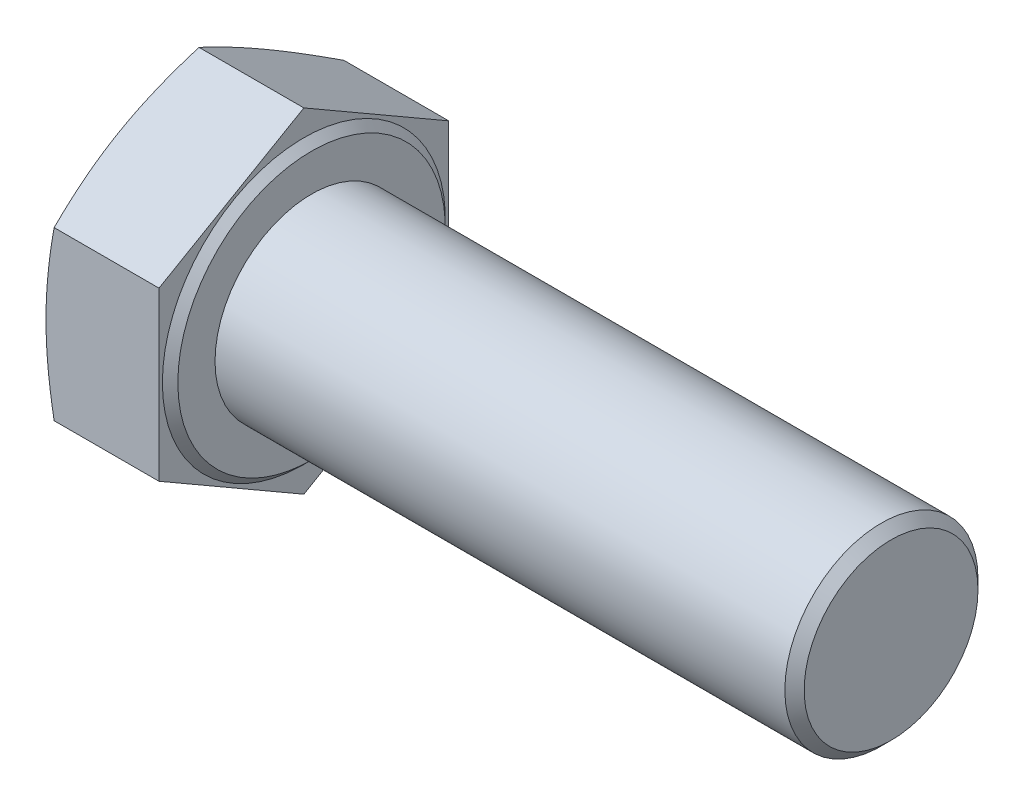
ISO-10303-21;
HEADER;
FILE_DESCRIPTION(('STEP AP214'),'2;1');
FILE_NAME('part.step','',(''),(''),'','','');
FILE_SCHEMA(('AUTOMOTIVE_DESIGN { 1 0 10303 214 1 1 1 1 }'));
ENDSEC;
DATA;
#1=APPLICATION_CONTEXT('core data for automotive mechanical design processes');
#2=APPLICATION_PROTOCOL_DEFINITION('international standard','automotive_design',2000,#1);
#3=PRODUCT_CONTEXT('',#1,'mechanical');
#4=PRODUCT('Part','Part','',(#3));
#5=PRODUCT_RELATED_PRODUCT_CATEGORY('part','',(#4));
#6=PRODUCT_DEFINITION_FORMATION('','',#4);
#7=PRODUCT_DEFINITION_CONTEXT('part definition',#1,'design');
#8=PRODUCT_DEFINITION('design','',#6,#7);
#9=PRODUCT_DEFINITION_SHAPE('','',#8);
#10=(LENGTH_UNIT() NAMED_UNIT(*) SI_UNIT(.MILLI.,.METRE.));
#11=(NAMED_UNIT(*) PLANE_ANGLE_UNIT() SI_UNIT($,.RADIAN.));
#12=(NAMED_UNIT(*) SI_UNIT($,.STERADIAN.) SOLID_ANGLE_UNIT());
#13=UNCERTAINTY_MEASURE_WITH_UNIT(LENGTH_MEASURE(1.E-05),#10,'distance_accuracy_value','');
#14=(GEOMETRIC_REPRESENTATION_CONTEXT(3) GLOBAL_UNCERTAINTY_ASSIGNED_CONTEXT((#13)) GLOBAL_UNIT_ASSIGNED_CONTEXT((#10,
#11,#12)) REPRESENTATION_CONTEXT('',''));
#15=CARTESIAN_POINT('',(0.,0.,0.));
#16=DIRECTION('',(0.,0.,1.));
#17=DIRECTION('',(1.,0.,0.));
#18=AXIS2_PLACEMENT_3D('',#15,#16,#17);
#19=CARTESIAN_POINT('',(-12.2341191525824,-14.3598036724861,16.3343559319878));
#20=DIRECTION('',(-1.,0.,0.));
#21=DIRECTION('',(0.,0.,1.));
#22=AXIS2_PLACEMENT_3D('',#19,#20,#21);
#23=PLANE('',#22);
#24=CARTESIAN_POINT('',(-12.2341191525824,-5.6995496346417,1.33435593198783));
#25=DIRECTION('',(-1.,0.,0.));
#26=DIRECTION('',(0.,0.,1.));
#27=AXIS2_PLACEMENT_3D('',#24,#25,#26);
#28=CIRCLE('',#27,13.85);
#29=CARTESIAN_POINT('',(-12.2341191525824,-5.6995496346417,15.1843559319878));
#30=VERTEX_POINT('',#29);
#31=EDGE_CURVE('E247',#30,#30,#28,.T.);
#32=ORIENTED_EDGE('',*,*,#31,.F.);
#33=EDGE_LOOP('',(#32));
#34=FACE_BOUND('',#33,.T.);
#35=CARTESIAN_POINT('',(-12.2341191525824,-5.6995496346417,1.33435593198783));
#36=DIRECTION('',(-1.,0.,0.));
#37=DIRECTION('',(0.,0.,1.));
#38=AXIS2_PLACEMENT_3D('',#35,#36,#37);
#39=CIRCLE('',#38,10.);
#40=CARTESIAN_POINT('',(-12.2341191525824,-5.6995496346417,11.3343559319878));
#41=VERTEX_POINT('',#40);
#42=EDGE_CURVE('E133',#41,#41,#39,.F.);
#43=ORIENTED_EDGE('',*,*,#42,.F.);
#44=EDGE_LOOP('',(#43));
#45=FACE_BOUND('',#44,.T.);
#46=ADVANCED_FACE('F16',(#34,#45),#23,.F.);
#47=CARTESIAN_POINT('',(-12.2341191525824,-14.3598036724861,16.3343559319878));
#48=DIRECTION('',(0.,0.866025403784439,-0.5));
#49=DIRECTION('',(0.,0.5,0.866025403784439));
#50=AXIS2_PLACEMENT_3D('',#47,#48,#49);
#51=PLANE('',#50);
#52=CARTESIAN_POINT('',(-23.8894812565745,-23.0201731803843,1.33415593198783));
#53=CARTESIAN_POINT('',(-23.9547548838417,-22.8408232676603,1.64479909315885));
#54=CARTESIAN_POINT('',(-24.0170929927835,-22.6612097713907,1.95589879442282));
#55=CARTESIAN_POINT('',(-24.1352523937545,-22.3014311375938,2.57905366763692));
#56=CARTESIAN_POINT('',(-24.1910730656882,-22.1212659492469,2.89110892760888));
#57=CARTESIAN_POINT('',(-24.3478444058877,-21.5797079193069,3.8291149507118));
#58=CARTESIAN_POINT('',(-24.4380123454216,-21.2175005518686,4.45647651399071));
#59=CARTESIAN_POINT('',(-24.5475953554052,-20.6746440418586,5.39673157054769));
#60=CARTESIAN_POINT('',(-24.5797520128152,-20.4946212295106,5.70854022805572));
#61=CARTESIAN_POINT('',(-24.635284128966,-20.1342394794231,6.33273972932794));
#62=CARTESIAN_POINT('',(-24.6586599459958,-19.9538805556998,6.64513054881506));
#63=CARTESIAN_POINT('',(-24.6962220561892,-19.592985111594,7.27021979422648));
#64=CARTESIAN_POINT('',(-24.7104114933449,-19.4124486731733,7.58291807818869));
#65=CARTESIAN_POINT('',(-24.7293600270075,-19.0512517200484,8.20852955254015));
#66=CARTESIAN_POINT('',(-24.7341191525824,-18.8705912057283,8.52144274226399));
#67=CARTESIAN_POINT('',(-24.7341191525824,-18.5092701770882,9.14726912171168));
#68=CARTESIAN_POINT('',(-24.7293600270075,-18.3286096627682,9.46018231143552));
#69=CARTESIAN_POINT('',(-24.7104114933449,-17.9674127096433,10.085793785787));
#70=CARTESIAN_POINT('',(-24.6962220561892,-17.7868762712225,10.3984920697492));
#71=CARTESIAN_POINT('',(-24.6586599459958,-17.4259808271167,11.0235813151606));
#72=CARTESIAN_POINT('',(-24.635284128966,-17.2456219033935,11.3359721346477));
#73=CARTESIAN_POINT('',(-24.5797520128152,-16.8852401533059,11.9601716359199));
#74=CARTESIAN_POINT('',(-24.5475953554052,-16.705217340958,12.271980293428));
#75=CARTESIAN_POINT('',(-24.4380123454216,-16.1623608309479,13.212235349985));
#76=CARTESIAN_POINT('',(-24.3478444058877,-15.8001534635096,13.8395969132639));
#77=CARTESIAN_POINT('',(-24.1910730656882,-15.2585954335697,14.7776029363668));
#78=CARTESIAN_POINT('',(-24.1352523937545,-15.0784302452228,15.0896581963387));
#79=CARTESIAN_POINT('',(-24.0170929927835,-14.7186516114258,15.7128130695528));
#80=CARTESIAN_POINT('',(-23.9547548838417,-14.5390381151562,16.0239127708168));
#81=CARTESIAN_POINT('',(-23.8894812565745,-14.3596882024322,16.3345559319878));
#82=B_SPLINE_CURVE_WITH_KNOTS('',3,(#52,#53,#54,#55,#56,#57,#58,#59,#60,#61,#62,#63,#64,#65,#66,
#67,#68,#69,#70,#71,#72,#73,#74,#75,#76,#77,#78,#79,#80,#81),.UNSPECIFIED.,.F.,.F.,(4,2,2,2,2,2,
2,2,2,2,2,2,2,2,4),(0.,1.0937389204757,2.18758181910093,4.37677976394879,5.46113055884809,
6.54543710363705,7.62937235352186,8.71330426227801,9.79723617103417,10.881171420919,
11.9654779657079,13.0498287606072,15.2390267054551,16.3328696040803,17.426608524556),.UNSPECIFIED.);
#83=CARTESIAN_POINT('',(-23.8895232846573,-23.0200577103305,1.33435593198784));
#84=VERTEX_POINT('',#83);
#85=CARTESIAN_POINT('',(-24.7341191525824,-18.6899306914083,8.83435593198783));
#86=VERTEX_POINT('',#85);
#87=EDGE_CURVE('E266',#84,#86,#82,.T.);
#88=ORIENTED_EDGE('',*,*,#87,.F.);
#89=DIRECTION('',(-1.,0.,0.));
#90=VECTOR('',#89,1.);
#91=CARTESIAN_POINT('',(-12.2341191525824,-23.0200577103305,1.33435593198783));
#92=LINE('',#91,#90);
#93=CARTESIAN_POINT('',(-13.0341191525824,-23.0200577103305,1.33435593198784));
#94=VERTEX_POINT('',#93);
#95=EDGE_CURVE('E126',#94,#84,#92,.T.);
#96=ORIENTED_EDGE('',*,*,#95,.F.);
#97=DIRECTION('',(0.,-0.5,-0.866025403784439));
#98=VECTOR('',#97,1.);
#99=CARTESIAN_POINT('',(-13.0341191525824,-14.3598036724861,16.3343559319878));
#100=LINE('',#99,#98);
#101=CARTESIAN_POINT('',(-13.0341191525824,-14.3598036724861,16.3343559319878));
#102=VERTEX_POINT('',#101);
#103=EDGE_CURVE('E119',#102,#94,#100,.T.);
#104=ORIENTED_EDGE('',*,*,#103,.F.);
#105=DIRECTION('',(-1.,0.,0.));
#106=VECTOR('',#105,1.);
#107=CARTESIAN_POINT('',(-12.2341191525824,-14.3598036724861,16.3343559319878));
#108=LINE('',#107,#106);
#109=CARTESIAN_POINT('',(-23.8895232846573,-14.3598036724861,16.3343559319878));
#110=VERTEX_POINT('',#109);
#111=EDGE_CURVE('E114',#102,#110,#108,.T.);
#112=ORIENTED_EDGE('',*,*,#111,.T.);
#113=EDGE_CURVE('E110',#86,#110,#82,.T.);
#114=ORIENTED_EDGE('',*,*,#113,.F.);
#115=EDGE_LOOP('',(#88,#96,#104,#112,#114));
#116=FACE_BOUND('',#115,.T.);
#117=ADVANCED_FACE('F151',(#116),#51,.F.);
#118=CARTESIAN_POINT('',(-12.2341191525824,-23.0200577103305,1.33435593198783));
#119=DIRECTION('',(0.,0.866025403784439,0.5));
#120=DIRECTION('',(0.,-0.5,0.866025403784439));
#121=AXIS2_PLACEMENT_3D('',#118,#119,#120);
#122=PLANE('',#121);
#123=CARTESIAN_POINT('',(-23.8894812565745,-14.3596882024323,-13.6658440680122));
#124=CARTESIAN_POINT('',(-23.9547548838417,-14.5390381151563,-13.3552009068411));
#125=CARTESIAN_POINT('',(-24.0170929927834,-14.7186516114258,-13.0441012055772));
#126=CARTESIAN_POINT('',(-24.1352523937545,-15.0784302452228,-12.4209463323631));
#127=CARTESIAN_POINT('',(-24.1910730656882,-15.2585954335697,-12.1088910723911));
#128=CARTESIAN_POINT('',(-24.3478444058877,-15.8001534635096,-11.1708850492882));
#129=CARTESIAN_POINT('',(-24.4380123454216,-16.1623608309479,-10.5435234860093));
#130=CARTESIAN_POINT('',(-24.5475953554052,-16.705217340958,-9.60326842945231));
#131=CARTESIAN_POINT('',(-24.5797520128152,-16.8852401533059,-9.29145977194428));
#132=CARTESIAN_POINT('',(-24.635284128966,-17.2456219033935,-8.66726027067206));
#133=CARTESIAN_POINT('',(-24.6586599459958,-17.4259808271167,-8.35486945118494));
#134=CARTESIAN_POINT('',(-24.6962220561892,-17.7868762712225,-7.72978020577352));
#135=CARTESIAN_POINT('',(-24.7104114933449,-17.9674127096433,-7.41708192181131));
#136=CARTESIAN_POINT('',(-24.7293600270075,-18.3286096627682,-6.79147044745985));
#137=CARTESIAN_POINT('',(-24.7341191525824,-18.5092701770882,-6.47855725773601));
#138=CARTESIAN_POINT('',(-24.7341191525824,-18.8705912057283,-5.85273087828832));
#139=CARTESIAN_POINT('',(-24.7293600270075,-19.0512517200484,-5.53981768856448));
#140=CARTESIAN_POINT('',(-24.7104114933449,-19.4124486731733,-4.91420621421303));
#141=CARTESIAN_POINT('',(-24.6962220561892,-19.592985111594,-4.60150793025081));
#142=CARTESIAN_POINT('',(-24.6586599459958,-19.9538805556998,-3.9764186848394));
#143=CARTESIAN_POINT('',(-24.635284128966,-20.1342394794231,-3.66402786535228));
#144=CARTESIAN_POINT('',(-24.5797520128152,-20.4946212295106,-3.03982836408006));
#145=CARTESIAN_POINT('',(-24.5475953554052,-20.6746440418586,-2.72801970657203));
#146=CARTESIAN_POINT('',(-24.4380123454216,-21.2175005518686,-1.78776465001505));
#147=CARTESIAN_POINT('',(-24.3478444058877,-21.5797079193069,-1.16040308673613));
#148=CARTESIAN_POINT('',(-24.1910730656882,-22.1212659492469,-0.222397063633215));
#149=CARTESIAN_POINT('',(-24.1352523937545,-22.3014311375938,0.0896581963387447));
#150=CARTESIAN_POINT('',(-24.0170929927835,-22.6612097713907,0.712813069552846));
#151=CARTESIAN_POINT('',(-23.9547548838417,-22.8408232676603,1.02391277081681));
#152=CARTESIAN_POINT('',(-23.8894812565745,-23.0201731803843,1.33455593198783));
#153=B_SPLINE_CURVE_WITH_KNOTS('',3,(#123,#124,#125,#126,#127,#128,#129,#130,#131,#132,#133,
#134,#135,#136,#137,#138,#139,#140,#141,#142,#143,#144,#145,#146,#147,#148,#149,#150,#151,#152),
.UNSPECIFIED.,.F.,.F.,(4,2,2,2,2,2,2,2,2,2,2,2,2,2,4),(0.,1.0937389204757,2.18758181910093,
4.37677976394879,5.46113055884808,6.54543710363705,7.62937235352185,8.71330426227801,
9.79723617103416,10.881171420919,11.9654779657079,13.0498287606072,15.2390267054551,
16.3328696040803,17.426608524556),.UNSPECIFIED.);
#154=CARTESIAN_POINT('',(-23.8895232846573,-14.3598036724861,-13.6656440680122));
#155=VERTEX_POINT('',#154);
#156=CARTESIAN_POINT('',(-24.7341191525824,-18.6899306914083,-6.16564406801217));
#157=VERTEX_POINT('',#156);
#158=EDGE_CURVE('E214',#155,#157,#153,.T.);
#159=ORIENTED_EDGE('',*,*,#158,.F.);
#160=DIRECTION('',(-1.,0.,0.));
#161=VECTOR('',#160,1.);
#162=CARTESIAN_POINT('',(-12.2341191525824,-14.3598036724861,-13.6656440680122));
#163=LINE('',#162,#161);
#164=CARTESIAN_POINT('',(-13.0341191525824,-14.3598036724861,-13.6656440680122));
#165=VERTEX_POINT('',#164);
#166=EDGE_CURVE('E123',#165,#155,#163,.T.);
#167=ORIENTED_EDGE('',*,*,#166,.F.);
#168=DIRECTION('',(0.,0.5,-0.866025403784439));
#169=VECTOR('',#168,1.);
#170=CARTESIAN_POINT('',(-13.0341191525824,-23.0200577103305,1.33435593198783));
#171=LINE('',#170,#169);
#172=EDGE_CURVE('E258',#94,#165,#171,.T.);
#173=ORIENTED_EDGE('',*,*,#172,.F.);
#174=ORIENTED_EDGE('',*,*,#95,.T.);
#175=EDGE_CURVE('E207',#157,#84,#153,.T.);
#176=ORIENTED_EDGE('',*,*,#175,.F.);
#177=EDGE_LOOP('',(#159,#167,#173,#174,#176));
#178=FACE_BOUND('',#177,.T.);
#179=ADVANCED_FACE('F160',(#178),#122,.F.);
#180=CARTESIAN_POINT('',(-12.2341191525824,-14.3598036724861,-13.6656440680122));
#181=DIRECTION('',(0.,0.,1.));
#182=DIRECTION('',(0.,-1.,0.));
#183=AXIS2_PLACEMENT_3D('',#180,#181,#182);
#184=PLANE('',#183);
#185=CARTESIAN_POINT('',(-20.2209329721132,-28.6288598341622,-13.6656440680122));
#186=CARTESIAN_POINT('',(-20.3242832294273,-28.2895376377914,-13.6656440680122));
#187=CARTESIAN_POINT('',(-20.4270084733524,-27.9500251803732,-13.6656440680122));
#188=CARTESIAN_POINT('',(-20.6310690121468,-27.2705807599396,-13.6656440680122));
#189=CARTESIAN_POINT('',(-20.7324042989082,-26.9306487944899,-13.6656440680122));
#190=CARTESIAN_POINT('',(-21.0341284064406,-25.9101208137535,-13.6656440680122));
#191=CARTESIAN_POINT('',(-21.232220154773,-25.228842864659,-13.6656440680122));
#192=CARTESIAN_POINT('',(-21.6212296812114,-23.8628622843919,-13.6656440680122));
#193=CARTESIAN_POINT('',(-21.812133384908,-23.1781556351615,-13.6656440680122));
#194=CARTESIAN_POINT('',(-22.1845482125691,-21.8061956491221,-13.6656440680122));
#195=CARTESIAN_POINT('',(-22.3660595051766,-21.1189423582761,-13.6656440680122));
#196=CARTESIAN_POINT('',(-22.7151924382224,-19.7499231383911,-13.6656440680122));
#197=CARTESIAN_POINT('',(-22.8829577382086,-19.0681940265762,-13.6656440680122));
#198=CARTESIAN_POINT('',(-23.2042053625981,-17.7013434549442,-13.6656440680122));
#199=CARTESIAN_POINT('',(-23.3576874466357,-17.0162219382423,-13.6656440680122));
#200=CARTESIAN_POINT('',(-23.646790037737,-15.6424332234755,-13.6656440680122));
#201=CARTESIAN_POINT('',(-23.7824166376376,-14.9537673186496,-13.6656440680122));
#202=CARTESIAN_POINT('',(-24.0316785552893,-13.5724373272673,-13.6656440680122));
#203=CARTESIAN_POINT('',(-24.1453146098521,-12.8797733754699,-13.6656440680122));
#204=CARTESIAN_POINT('',(-24.3347273165073,-11.5684440903674,-13.6656440680122));
#205=CARTESIAN_POINT('',(-24.4133202483922,-10.9501893744705,-13.6656440680122));
#206=CARTESIAN_POINT('',(-24.546359361633,-9.71106565517834,-13.6656440680122));
#207=CARTESIAN_POINT('',(-24.6008062466296,-9.09019672849626,-13.6656440680122));
#208=CARTESIAN_POINT('',(-24.6829312144127,-7.84710393836192,-13.6656440680122));
#209=CARTESIAN_POINT('',(-24.7106282311666,-7.22488134617313,-13.6656440680122));
#210=CARTESIAN_POINT('',(-24.7378511684957,-5.97981364138601,-13.6656440680122));
#211=CARTESIAN_POINT('',(-24.7373772880131,-5.35696853321494,-13.6656440680122));
#212=CARTESIAN_POINT('',(-24.7082104024395,-4.10878989033801,-13.6656440680122));
#213=CARTESIAN_POINT('',(-24.6793742963065,-3.48345975521493,-13.6656440680122));
#214=CARTESIAN_POINT('',(-24.5948100043848,-2.23463623522468,-13.6656440680122));
#215=CARTESIAN_POINT('',(-24.5390811725165,-1.61114289484735,-13.6656440680122));
#216=CARTESIAN_POINT('',(-24.4033383969303,-0.366300835734287,-13.6656440680122));
#217=CARTESIAN_POINT('',(-24.3233035943063,0.255045575505742,-13.6656440680122));
#218=CARTESIAN_POINT('',(-24.1421953061251,1.49462995235301,-13.6656440680122));
#219=CARTESIAN_POINT('',(-24.0411217078054,2.11286790128151,-13.6656440680122));
#220=CARTESIAN_POINT('',(-23.8154091943672,3.37876818013049,-13.6656440680122));
#221=CARTESIAN_POINT('',(-23.6898065811367,4.02625714923843,-13.6656440680122));
#222=CARTESIAN_POINT('',(-23.4224355520736,5.31791008305223,-13.6656440680122));
#223=CARTESIAN_POINT('',(-23.2806659174878,5.96207379325174,-13.6656440680122));
#224=CARTESIAN_POINT('',(-22.9839377168707,7.24753523433752,-13.6656440680122));
#225=CARTESIAN_POINT('',(-22.8289753204912,7.88883207559363,-13.6656440680122));
#226=CARTESIAN_POINT('',(-22.5083823787408,9.16872426392799,-13.6656440680122));
#227=CARTESIAN_POINT('',(-22.3427520890757,9.80731967536786,-13.6656440680122));
#228=CARTESIAN_POINT('',(-22.002599157805,11.083007822965,-13.6656440680122));
#229=CARTESIAN_POINT('',(-21.8280653693832,11.7200975760821,-13.6656440680122));
#230=CARTESIAN_POINT('',(-21.471897922539,12.9922866733245,-13.6656440680122));
#231=CARTESIAN_POINT('',(-21.2902642339963,13.6273860089933,-13.6656440680122));
#232=CARTESIAN_POINT('',(-20.9211965805515,14.8957778614555,-13.6656440680122));
#233=CARTESIAN_POINT('',(-20.7337635938998,15.5290706635099,-13.6656440680122));
#234=CARTESIAN_POINT('',(-20.3540756460204,16.7942051836908,-13.6656440680122));
#235=CARTESIAN_POINT('',(-20.1618206950776,17.4260469049092,-13.6656440680122));
#236=CARTESIAN_POINT('',(-19.7754381811994,18.6815223224592,-13.6656440680122));
#237=CARTESIAN_POINT('',(-19.5813547363449,19.3051696141412,-13.6656440680122));
#238=CARTESIAN_POINT('',(-19.1898778221984,20.5514251970612,-13.6656440680122));
#239=CARTESIAN_POINT('',(-18.9924843431043,21.1740334852163,-13.6656440680122));
#240=CARTESIAN_POINT('',(-18.3961051767288,23.0405758038232,-13.6656440680122));
#241=CARTESIAN_POINT('',(-17.9929373836043,24.2831736064607,-13.6656440680122));
#242=CARTESIAN_POINT('',(-17.18001634419,26.7609833659856,-13.6656440680122));
#243=CARTESIAN_POINT('',(-16.7702938897018,27.9962054575952,-13.6656440680122));
#244=CARTESIAN_POINT('',(-16.1511610524114,29.8474591428147,-13.6656440680122));
#245=CARTESIAN_POINT('',(-15.9440336826229,30.4642556481786,-13.6656440680122));
#246=CARTESIAN_POINT('',(-15.5284386863968,31.6973953628324,-13.6656440680122));
#247=CARTESIAN_POINT('',(-15.3199710632262,32.3137385732231,-13.6656440680122));
#248=CARTESIAN_POINT('',(-15.110923520567,32.9298849065947,-13.6656440680122));
#249=B_SPLINE_CURVE_WITH_KNOTS('',3,(#185,#186,#187,#188,#189,#190,#191,#192,#193,#194,#195,
#196,#197,#198,#199,#200,#201,#202,#203,#204,#205,#206,#207,#208,#209,#210,#211,#212,#213,#214,
#215,#216,#217,#218,#219,#220,#221,#222,#223,#224,#225,#226,#227,#228,#229,#230,#231,#232,#233,
#234,#235,#236,#237,#238,#239,#240,#241,#242,#243,#244,#245,#246,#247,#248),.UNSPECIFIED.,.F.,
.F.,(4,2,2,2,2,2,2,2,2,2,2,2,2,2,2,2,2,2,2,2,2,2,2,2,2,2,2,2,2,2,2,4),(0.,1.06413582320334,
2.12827785113375,4.25671921670231,6.38913172514888,8.52150593234148,10.6275890757767,
12.7337076550942,14.839105689268,16.9444331680835,18.8137129578023,20.6829382711992,
22.550839546466,24.4187276306658,26.2960887053044,28.1734948845254,30.0525167915827,
31.9315487699627,33.9099725218488,35.888545516223,37.867694935706,39.8467969333057,
41.8284405896339,43.8100926537094,45.791412247319,47.7727276152368,49.7321653417095,
51.6916088716942,55.6106645152124,59.5148499534233,61.4667854208947,63.4187161322426),.UNSPECIFIED.);
#250=CARTESIAN_POINT('',(-23.8895232846573,2.96070440320269,-13.6656440680122));
#251=VERTEX_POINT('',#250);
#252=CARTESIAN_POINT('',(-24.7341191525824,-5.6995496346417,-13.6656440680122));
#253=VERTEX_POINT('',#252);
#254=EDGE_CURVE('E295',#251,#253,#249,.F.);
#255=ORIENTED_EDGE('',*,*,#254,.F.);
#256=DIRECTION('',(-1.,0.,0.));
#257=VECTOR('',#256,1.);
#258=CARTESIAN_POINT('',(-12.2341191525824,2.9607044032027,-13.6656440680122));
#259=LINE('',#258,#257);
#260=CARTESIAN_POINT('',(-13.0341191525824,2.96070440320269,-13.6656440680122));
#261=VERTEX_POINT('',#260);
#262=EDGE_CURVE('E113',#261,#251,#259,.T.);
#263=ORIENTED_EDGE('',*,*,#262,.F.);
#264=DIRECTION('',(0.,1.,0.));
#265=VECTOR('',#264,1.);
#266=CARTESIAN_POINT('',(-13.0341191525824,-14.3598036724861,-13.6656440680122));
#267=LINE('',#266,#265);
#268=EDGE_CURVE('E249',#165,#261,#267,.T.);
#269=ORIENTED_EDGE('',*,*,#268,.F.);
#270=ORIENTED_EDGE('',*,*,#166,.T.);
#271=EDGE_CURVE('E216',#253,#155,#249,.F.);
#272=ORIENTED_EDGE('',*,*,#271,.F.);
#273=EDGE_LOOP('',(#255,#263,#269,#270,#272));
#274=FACE_BOUND('',#273,.T.);
#275=ADVANCED_FACE('F223',(#274),#184,.F.);
#276=CARTESIAN_POINT('',(-12.2341191525824,2.9607044032027,-13.6656440680122));
#277=DIRECTION('',(0.,-0.866025403784439,0.5));
#278=DIRECTION('',(0.,-0.5,-0.866025403784439));
#279=AXIS2_PLACEMENT_3D('',#276,#277,#278);
#280=PLANE('',#279);
#281=CARTESIAN_POINT('',(-23.8894812565745,11.6210739111009,1.33455593198783));
#282=CARTESIAN_POINT('',(-23.9547548838417,11.4417239983769,1.02391277081681));
#283=CARTESIAN_POINT('',(-24.0170929927834,11.2621105021074,0.712813069552845));
#284=CARTESIAN_POINT('',(-24.1352523937545,10.9023318683104,0.0896581963387437));
#285=CARTESIAN_POINT('',(-24.1910730656882,10.7221666799635,-0.222397063633216));
#286=CARTESIAN_POINT('',(-24.3478444058877,10.1806086500236,-1.16040308673613));
#287=CARTESIAN_POINT('',(-24.4380123454216,9.81840128258525,-1.78776465001505));
#288=CARTESIAN_POINT('',(-24.5475953554052,9.27554477257517,-2.72801970657203));
#289=CARTESIAN_POINT('',(-24.5797520128152,9.09552196022725,-3.03982836408006));
#290=CARTESIAN_POINT('',(-24.635284128966,8.73514021013971,-3.66402786535228));
#291=CARTESIAN_POINT('',(-24.6586599459958,8.55478128641645,-3.9764186848394));
#292=CARTESIAN_POINT('',(-24.6962220561892,8.19388584231063,-4.60150793025081));
#293=CARTESIAN_POINT('',(-24.7104114933449,8.01334940388991,-4.91420621421303));
#294=CARTESIAN_POINT('',(-24.7293600270075,7.65215245076498,-5.53981768856448));
#295=CARTESIAN_POINT('',(-24.7341191525824,7.47149193644494,-5.85273087828832));
#296=CARTESIAN_POINT('',(-24.7341191525824,7.11017090780485,-6.47855725773601));
#297=CARTESIAN_POINT('',(-24.7293600270075,6.9295103934848,-6.79147044745985));
#298=CARTESIAN_POINT('',(-24.7104114933449,6.56831344035987,-7.41708192181131));
#299=CARTESIAN_POINT('',(-24.6962220561892,6.38777700193915,-7.72978020577352));
#300=CARTESIAN_POINT('',(-24.6586599459958,6.02688155783333,-8.35486945118493));
#301=CARTESIAN_POINT('',(-24.635284128966,5.84652263411008,-8.66726027067205));
#302=CARTESIAN_POINT('',(-24.5797520128152,5.48614088402253,-9.29145977194427));
#303=CARTESIAN_POINT('',(-24.5475953554052,5.30611807167462,-9.6032684294523));
#304=CARTESIAN_POINT('',(-24.4380123454216,4.76326156166454,-10.5435234860093));
#305=CARTESIAN_POINT('',(-24.3478444058877,4.40105419422623,-11.1708850492882));
#306=CARTESIAN_POINT('',(-24.1910730656882,3.85949616428627,-12.1088910723911));
#307=CARTESIAN_POINT('',(-24.1352523937545,3.67933097593942,-12.4209463323631));
#308=CARTESIAN_POINT('',(-24.0170929927835,3.31955234214243,-13.0441012055772));
#309=CARTESIAN_POINT('',(-23.9547548838417,3.13993884587287,-13.3552009068411));
#310=CARTESIAN_POINT('',(-23.8894812565745,2.96058893314886,-13.6658440680122));
#311=B_SPLINE_CURVE_WITH_KNOTS('',3,(#281,#282,#283,#284,#285,#286,#287,#288,#289,#290,#291,
#292,#293,#294,#295,#296,#297,#298,#299,#300,#301,#302,#303,#304,#305,#306,#307,#308,#309,#310),
.UNSPECIFIED.,.F.,.F.,(4,2,2,2,2,2,2,2,2,2,2,2,2,2,4),(0.,1.0937389204757,2.18758181910093,
4.37677976394879,5.46113055884808,6.54543710363705,7.62937235352185,8.713304262278,
9.79723617103416,10.881171420919,11.9654779657079,13.0498287606072,15.2390267054551,
16.3328696040803,17.426608524556),.UNSPECIFIED.);
#312=CARTESIAN_POINT('',(-23.8895232846573,11.6209584410471,1.33435593198783));
#313=VERTEX_POINT('',#312);
#314=CARTESIAN_POINT('',(-24.7341191525824,7.29083142212488,-6.16564406801217));
#315=VERTEX_POINT('',#314);
#316=EDGE_CURVE('E201',#313,#315,#311,.T.);
#317=ORIENTED_EDGE('',*,*,#316,.F.);
#318=DIRECTION('',(-1.,0.,0.));
#319=VECTOR('',#318,1.);
#320=CARTESIAN_POINT('',(-12.2341191525824,11.6209584410471,1.33435593198783));
#321=LINE('',#320,#319);
#322=CARTESIAN_POINT('',(-13.0341191525824,11.6209584410471,1.33435593198783));
#323=VERTEX_POINT('',#322);
#324=EDGE_CURVE('E115',#323,#313,#321,.T.);
#325=ORIENTED_EDGE('',*,*,#324,.F.);
#326=DIRECTION('',(0.,0.5,0.866025403784439));
#327=VECTOR('',#326,1.);
#328=CARTESIAN_POINT('',(-13.0341191525824,2.9607044032027,-13.6656440680122));
#329=LINE('',#328,#327);
#330=EDGE_CURVE('E244',#261,#323,#329,.T.);
#331=ORIENTED_EDGE('',*,*,#330,.F.);
#332=ORIENTED_EDGE('',*,*,#262,.T.);
#333=EDGE_CURVE('E245',#315,#251,#311,.T.);
#334=ORIENTED_EDGE('',*,*,#333,.F.);
#335=EDGE_LOOP('',(#317,#325,#331,#332,#334));
#336=FACE_BOUND('',#335,.T.);
#337=ADVANCED_FACE('F230',(#336),#280,.F.);
#338=CARTESIAN_POINT('',(-12.2341191525824,11.6209584410471,1.33435593198783));
#339=DIRECTION('',(0.,-0.866025403784439,-0.5));
#340=DIRECTION('',(0.,0.5,-0.866025403784439));
#341=AXIS2_PLACEMENT_3D('',#338,#339,#340);
#342=PLANE('',#341);
#343=CARTESIAN_POINT('',(-23.8894812565745,2.96058893314886,16.3345559319878));
#344=CARTESIAN_POINT('',(-23.9547548838417,3.13993884587287,16.0239127708168));
#345=CARTESIAN_POINT('',(-24.0170929927834,3.31955234214243,15.7128130695528));
#346=CARTESIAN_POINT('',(-24.1352523937545,3.67933097593942,15.0896581963387));
#347=CARTESIAN_POINT('',(-24.1910730656882,3.85949616428627,14.7776029363668));
#348=CARTESIAN_POINT('',(-24.3478444058877,4.40105419422623,13.8395969132639));
#349=CARTESIAN_POINT('',(-24.4380123454216,4.76326156166453,13.2122353499849));
#350=CARTESIAN_POINT('',(-24.5475953554052,5.30611807167461,12.271980293428));
#351=CARTESIAN_POINT('',(-24.5797520128152,5.48614088402253,11.9601716359199));
#352=CARTESIAN_POINT('',(-24.635284128966,5.84652263411007,11.3359721346477));
#353=CARTESIAN_POINT('',(-24.6586599459958,6.02688155783333,11.0235813151606));
#354=CARTESIAN_POINT('',(-24.6962220561892,6.38777700193915,10.3984920697492));
#355=CARTESIAN_POINT('',(-24.7104114933449,6.56831344035987,10.085793785787));
#356=CARTESIAN_POINT('',(-24.7293600270075,6.9295103934848,9.46018231143552));
#357=CARTESIAN_POINT('',(-24.7341191525824,7.11017090780484,9.14726912171168));
#358=CARTESIAN_POINT('',(-24.7341191525824,7.47149193644494,8.52144274226399));
#359=CARTESIAN_POINT('',(-24.7293600270075,7.65215245076498,8.20852955254015));
#360=CARTESIAN_POINT('',(-24.7104114933449,8.01334940388991,7.58291807818869));
#361=CARTESIAN_POINT('',(-24.6962220561892,8.19388584231063,7.27021979422648));
#362=CARTESIAN_POINT('',(-24.6586599459958,8.55478128641645,6.64513054881506));
#363=CARTESIAN_POINT('',(-24.635284128966,8.73514021013971,6.33273972932794));
#364=CARTESIAN_POINT('',(-24.5797520128152,9.09552196022725,5.70854022805572));
#365=CARTESIAN_POINT('',(-24.5475953554052,9.27554477257517,5.39673157054769));
#366=CARTESIAN_POINT('',(-24.4380123454216,9.81840128258524,4.45647651399071));
#367=CARTESIAN_POINT('',(-24.3478444058877,10.1806086500236,3.8291149507118));
#368=CARTESIAN_POINT('',(-24.1910730656882,10.7221666799635,2.89110892760888));
#369=CARTESIAN_POINT('',(-24.1352523937545,10.9023318683104,2.57905366763692));
#370=CARTESIAN_POINT('',(-24.0170929927834,11.2621105021074,1.95589879442282));
#371=CARTESIAN_POINT('',(-23.9547548838417,11.4417239983769,1.64479909315885));
#372=CARTESIAN_POINT('',(-23.8894812565745,11.6210739111009,1.33415593198783));
#373=B_SPLINE_CURVE_WITH_KNOTS('',3,(#343,#344,#345,#346,#347,#348,#349,#350,#351,#352,#353,
#354,#355,#356,#357,#358,#359,#360,#361,#362,#363,#364,#365,#366,#367,#368,#369,#370,#371,#372),
.UNSPECIFIED.,.F.,.F.,(4,2,2,2,2,2,2,2,2,2,2,2,2,2,4),(0.,1.0937389204757,2.18758181910093,
4.37677976394879,5.46113055884809,6.54543710363705,7.62937235352186,8.71330426227801,
9.79723617103416,10.881171420919,11.9654779657079,13.0498287606072,15.2390267054551,
16.3328696040803,17.426608524556),.UNSPECIFIED.);
#374=CARTESIAN_POINT('',(-23.8895232846573,2.9607044032027,16.3343559319878));
#375=VERTEX_POINT('',#374);
#376=CARTESIAN_POINT('',(-24.7341191525824,7.29083142212489,8.83435593198783));
#377=VERTEX_POINT('',#376);
#378=EDGE_CURVE('E95',#375,#377,#373,.T.);
#379=ORIENTED_EDGE('',*,*,#378,.F.);
#380=DIRECTION('',(-1.,0.,0.));
#381=VECTOR('',#380,1.);
#382=CARTESIAN_POINT('',(-12.2341191525824,2.9607044032027,16.3343559319878));
#383=LINE('',#382,#381);
#384=CARTESIAN_POINT('',(-13.0341191525824,2.9607044032027,16.3343559319878));
#385=VERTEX_POINT('',#384);
#386=EDGE_CURVE('E102',#385,#375,#383,.T.);
#387=ORIENTED_EDGE('',*,*,#386,.F.);
#388=DIRECTION('',(0.,-0.5,0.866025403784439));
#389=VECTOR('',#388,1.);
#390=CARTESIAN_POINT('',(-13.0341191525824,11.6209584410471,1.33435593198783));
#391=LINE('',#390,#389);
#392=EDGE_CURVE('E39',#323,#385,#391,.T.);
#393=ORIENTED_EDGE('',*,*,#392,.F.);
#394=ORIENTED_EDGE('',*,*,#324,.T.);
#395=EDGE_CURVE('E106',#377,#313,#373,.T.);
#396=ORIENTED_EDGE('',*,*,#395,.F.);
#397=EDGE_LOOP('',(#379,#387,#393,#394,#396));
#398=FACE_BOUND('',#397,.T.);
#399=ADVANCED_FACE('F103',(#398),#342,.F.);
#400=CARTESIAN_POINT('',(-12.2341191525824,2.9607044032027,16.3343559319878));
#401=DIRECTION('',(0.,0.,-1.));
#402=DIRECTION('',(-1.,0.,0.));
#403=AXIS2_PLACEMENT_3D('',#400,#401,#402);
#404=PLANE('',#403);
#405=CARTESIAN_POINT('',(-20.2209337829028,-28.6288571722121,16.3343559319878));
#406=CARTESIAN_POINT('',(-20.3242840209217,-28.2895350273865,16.3343559319878));
#407=CARTESIAN_POINT('',(-20.4270092455843,-27.95002262153,16.3343559319878));
#408=CARTESIAN_POINT('',(-20.631069745943,-27.2705783042622,16.3343559319878));
#409=CARTESIAN_POINT('',(-20.732405013531,-26.9306463904164,16.3343559319878));
#410=CARTESIAN_POINT('',(-21.0341290637081,-25.9101185645808,16.3343559319878));
#411=CARTESIAN_POINT('',(-21.2322207740278,-25.2288407188593,16.3343559319878));
#412=CARTESIAN_POINT('',(-21.6212302249675,-23.8628603462987,16.3343559319878));
#413=CARTESIAN_POINT('',(-21.8121338911846,-23.178153801404,16.3343559319878));
#414=CARTESIAN_POINT('',(-22.184548645065,-21.8061940244692,16.3343559319878));
#415=CARTESIAN_POINT('',(-22.3660599013712,-21.1189408383923,16.3343559319878));
#416=CARTESIAN_POINT('',(-22.7151927640838,-19.7499218273598,16.3343559319878));
#417=CARTESIAN_POINT('',(-22.8829580300154,-19.0681928196207,16.3343559319878));
#418=CARTESIAN_POINT('',(-23.2042055890088,-17.7013424569742,16.3343559319878));
#419=CARTESIAN_POINT('',(-23.3576876417053,-17.0162210451819,16.3343559319878));
#420=CARTESIAN_POINT('',(-23.6467901742216,-15.6424325410379,16.3343559319878));
#421=CARTESIAN_POINT('',(-23.7824167468716,-14.9537667419236,16.3343559319878));
#422=CARTESIAN_POINT('',(-24.0316786158312,-13.5724369631704,16.3343559319878));
#423=CARTESIAN_POINT('',(-24.1453146489512,-12.8797731182903,16.3343559319878));
#424=CARTESIAN_POINT('',(-24.3347273400766,-11.5684439152083,16.3343559319878));
#425=CARTESIAN_POINT('',(-24.4133202729215,-10.9501891736866,16.3343559319878));
#426=CARTESIAN_POINT('',(-24.5463593857379,-9.71106540300715,16.3343559319878));
#427=CARTESIAN_POINT('',(-24.6008062693502,-9.09019645056244,16.3343559319878));
#428=CARTESIAN_POINT('',(-24.6829312318219,-7.84710360895744,16.3343559319878));
#429=CARTESIAN_POINT('',(-24.7106282446513,-7.22488099106065,16.3343559319878));
#430=CARTESIAN_POINT('',(-24.737851171661,-5.97981323506527,16.3343559319878));
#431=CARTESIAN_POINT('',(-24.7373772847834,-5.35696810139392,16.3343559319878));
#432=CARTESIAN_POINT('',(-24.7082103842437,-4.10878940682891,16.3343559319878));
#433=CARTESIAN_POINT('',(-24.6793742694868,-3.48345924552088,16.3343559319878));
#434=CARTESIAN_POINT('',(-24.594809958655,-2.23463567360875,16.3343559319878));
#435=CARTESIAN_POINT('',(-24.5390811165002,-1.61114230749452,16.3343559319878));
#436=CARTESIAN_POINT('',(-24.4033383192618,-0.366300197240633,16.3343559319878));
#437=CARTESIAN_POINT('',(-24.3233035052681,0.255046239402595,16.3343559319878));
#438=CARTESIAN_POINT('',(-24.1421951937909,1.49463066670134,16.3343559319878));
#439=CARTESIAN_POINT('',(-24.041121583545,2.11286864067813,16.3343559319878));
#440=CARTESIAN_POINT('',(-23.8154090500752,3.37876894462761,16.3343559319878));
#441=CARTESIAN_POINT('',(-23.6898064295189,4.02625791391593,16.3343559319878));
#442=CARTESIAN_POINT('',(-23.4224353870227,5.31791084817297,16.3343559319878));
#443=CARTESIAN_POINT('',(-23.2806657463298,5.96207455863538,16.3343559319878));
#444=CARTESIAN_POINT('',(-22.9839375345312,7.24753600033972,16.3343559319878));
#445=CARTESIAN_POINT('',(-22.8289751330782,7.88883284195171,16.3343559319878));
#446=CARTESIAN_POINT('',(-22.5083821820203,9.16872503113648,16.3343559319878));
#447=CARTESIAN_POINT('',(-22.3427518881211,9.80732044307087,16.3343559319878));
#448=CARTESIAN_POINT('',(-22.0025989491228,11.0830085915238,16.3343559319878));
#449=CARTESIAN_POINT('',(-21.8280651572117,11.7200983450033,16.3343559319878));
#450=CARTESIAN_POINT('',(-21.4718977039344,12.992287443089,16.3343559319878));
#451=CARTESIAN_POINT('',(-21.2902640124479,13.6273867792389,16.3343559319878));
#452=CARTESIAN_POINT('',(-20.9211963535452,14.8957786327828,16.3343559319878));
#453=CARTESIAN_POINT('',(-20.7337633643793,15.5290714354377,16.3343559319878));
#454=CARTESIAN_POINT('',(-20.3540754118179,16.7942059569079,16.3343559319878));
#455=CARTESIAN_POINT('',(-20.1618204587074,17.426047678815,16.3343559319878));
#456=CARTESIAN_POINT('',(-19.7754379420572,18.6815230937036,16.3343559319878));
#457=CARTESIAN_POINT('',(-19.5813544966213,19.3051703820427,16.3343559319878));
#458=CARTESIAN_POINT('',(-19.1898775815719,20.5514259583504,16.3343559319878));
#459=CARTESIAN_POINT('',(-18.9924841021564,21.1740342432362,16.3343559319878));
#460=CARTESIAN_POINT('',(-18.396104935132,23.0405765521183,16.3343559319878));
#461=CARTESIAN_POINT('',(-17.9929371419927,24.283174348392,16.3343559319878));
#462=CARTESIAN_POINT('',(-17.1800161027681,26.7609840963955,16.3343559319878));
#463=CARTESIAN_POINT('',(-16.770293648476,27.9962061828447,16.3343559319878));
#464=CARTESIAN_POINT('',(-16.1511608117552,29.8474598604198,16.3343559319878));
#465=CARTESIAN_POINT('',(-15.9440334422012,30.4642563632554,16.3343559319878));
#466=CARTESIAN_POINT('',(-15.5284384465227,31.6973960728781,16.3343559319878));
#467=CARTESIAN_POINT('',(-15.3199708236651,32.3137392807659,16.3343559319878));
#468=CARTESIAN_POINT('',(-15.1109232813512,32.9298856116452,16.3343559319878));
#469=B_SPLINE_CURVE_WITH_KNOTS('',3,(#405,#406,#407,#408,#409,#410,#411,#412,#413,#414,#415,
#416,#417,#418,#419,#420,#421,#422,#423,#424,#425,#426,#427,#428,#429,#430,#431,#432,#433,#434,
#435,#436,#437,#438,#439,#440,#441,#442,#443,#444,#445,#446,#447,#448,#449,#450,#451,#452,#453,
#454,#455,#456,#457,#458,#459,#460,#461,#462,#463,#464,#465,#466,#467,#468),.UNSPECIFIED.,.F.,
.F.,(4,2,2,2,2,2,2,2,2,2,2,2,2,2,2,2,2,2,2,2,2,2,2,2,2,2,2,2,2,2,2,4),(0.,1.06413565841146,
2.12827752154929,4.25671855749246,6.38913073423828,8.5215046097452,10.6275874256082,
12.7337056773064,14.8391033846144,16.9444305366981,18.81371040297,20.6829357929184,
22.5508371446207,24.4187253052562,26.2960864594961,28.1734927183341,30.052514705322,
31.9315467636347,33.9099705202768,35.8885435193839,37.8676929434973,39.8467949457336,
41.8284386058837,43.8100906737801,45.7914102712613,47.7727256430511,49.732163360468,
51.6916068813959,55.6106625067742,59.5148479301085,61.4667833901658,63.4187140941002),.UNSPECIFIED.);
#470=CARTESIAN_POINT('',(-24.7341191525824,-5.6995496346417,16.3343559319878));
#471=VERTEX_POINT('',#470);
#472=EDGE_CURVE('E98',#110,#471,#469,.T.);
#473=ORIENTED_EDGE('',*,*,#472,.F.);
#474=ORIENTED_EDGE('',*,*,#111,.F.);
#475=DIRECTION('',(0.,-1.,0.));
#476=VECTOR('',#475,1.);
#477=CARTESIAN_POINT('',(-13.0341191525824,2.9607044032027,16.3343559319878));
#478=LINE('',#477,#476);
#479=EDGE_CURVE('E112',#385,#102,#478,.T.);
#480=ORIENTED_EDGE('',*,*,#479,.F.);
#481=ORIENTED_EDGE('',*,*,#386,.T.);
#482=EDGE_CURVE('E90',#471,#375,#469,.T.);
#483=ORIENTED_EDGE('',*,*,#482,.F.);
#484=EDGE_LOOP('',(#473,#474,#480,#481,#483));
#485=FACE_BOUND('',#484,.T.);
#486=ADVANCED_FACE('F108',(#485),#404,.F.);
#487=CARTESIAN_POINT('',(-13.0341191525824,8.95045036535831,1.33435593198783));
#488=DIRECTION('',(1.,0.,0.));
#489=DIRECTION('',(0.,0.,-1.));
#490=AXIS2_PLACEMENT_3D('',#487,#488,#489);
#491=PLANE('',#490);
#492=CARTESIAN_POINT('',(-13.0341191525824,-5.6995496346417,1.33435593198783));
#493=DIRECTION('',(-1.,0.,0.));
#494=DIRECTION('',(0.,0.,1.));
#495=AXIS2_PLACEMENT_3D('',#492,#493,#494);
#496=CIRCLE('',#495,14.65);
#497=CARTESIAN_POINT('',(-13.0341191525824,-5.6995496346417,15.9843559319878));
#498=VERTEX_POINT('',#497);
#499=EDGE_CURVE('E252',#498,#498,#496,.T.);
#500=ORIENTED_EDGE('',*,*,#499,.T.);
#501=EDGE_LOOP('',(#500));
#502=FACE_BOUND('',#501,.T.);
#503=ORIENTED_EDGE('',*,*,#103,.T.);
#504=ORIENTED_EDGE('',*,*,#172,.T.);
#505=ORIENTED_EDGE('',*,*,#268,.T.);
#506=ORIENTED_EDGE('',*,*,#330,.T.);
#507=ORIENTED_EDGE('',*,*,#392,.T.);
#508=ORIENTED_EDGE('',*,*,#479,.T.);
#509=EDGE_LOOP('',(#503,#504,#505,#506,#507,#508));
#510=FACE_BOUND('',#509,.T.);
#511=ADVANCED_FACE('F171',(#502,#510),#491,.T.);
#512=CARTESIAN_POINT('',(-13.0341191525824,-5.6995496346417,1.33435593198783));
#513=DIRECTION('',(-1.,0.,0.));
#514=DIRECTION('',(0.,0.,1.));
#515=AXIS2_PLACEMENT_3D('',#512,#513,#514);
#516=CONICAL_SURFACE('',#515,14.65,0.785398163397454);
#517=ORIENTED_EDGE('',*,*,#31,.T.);
#518=EDGE_LOOP('',(#517));
#519=FACE_BOUND('',#518,.T.);
#520=ORIENTED_EDGE('',*,*,#499,.F.);
#521=EDGE_LOOP('',(#520));
#522=FACE_BOUND('',#521,.T.);
#523=ADVANCED_FACE('F162',(#519,#522),#516,.T.);
#524=CARTESIAN_POINT('',(-24.7341191525824,-5.6995496346417,1.33435593198783));
#525=DIRECTION('',(1.,0.,0.));
#526=DIRECTION('',(0.,0.,-1.));
#527=AXIS2_PLACEMENT_3D('',#524,#525,#526);
#528=CONICAL_SURFACE('',#527,15.,1.22173047639604);
#529=ORIENTED_EDGE('',*,*,#113,.T.);
#530=ORIENTED_EDGE('',*,*,#472,.T.);
#531=CARTESIAN_POINT('',(-24.7341191525824,-5.6995496346417,1.33435593198783));
#532=DIRECTION('',(-1.,0.,0.));
#533=DIRECTION('',(0.,0.,1.));
#534=AXIS2_PLACEMENT_3D('',#531,#532,#533);
#535=CIRCLE('',#534,15.);
#536=EDGE_CURVE('E33',#86,#471,#535,.T.);
#537=ORIENTED_EDGE('',*,*,#536,.F.);
#538=EDGE_LOOP('',(#529,#530,#537));
#539=FACE_BOUND('',#538,.T.);
#540=ADVANCED_FACE('F269',(#539),#528,.T.);
#541=ORIENTED_EDGE('',*,*,#175,.T.);
#542=ORIENTED_EDGE('',*,*,#87,.T.);
#543=EDGE_CURVE('E135',#157,#86,#535,.T.);
#544=ORIENTED_EDGE('',*,*,#543,.F.);
#545=EDGE_LOOP('',(#541,#542,#544));
#546=FACE_BOUND('',#545,.T.);
#547=ADVANCED_FACE('F276',(#546),#528,.T.);
#548=ORIENTED_EDGE('',*,*,#271,.T.);
#549=ORIENTED_EDGE('',*,*,#158,.T.);
#550=EDGE_CURVE('E273',#253,#157,#535,.T.);
#551=ORIENTED_EDGE('',*,*,#550,.F.);
#552=EDGE_LOOP('',(#548,#549,#551));
#553=FACE_BOUND('',#552,.T.);
#554=ADVANCED_FACE('F189',(#553),#528,.T.);
#555=ORIENTED_EDGE('',*,*,#254,.T.);
#556=EDGE_CURVE('E274',#315,#253,#535,.T.);
#557=ORIENTED_EDGE('',*,*,#556,.F.);
#558=ORIENTED_EDGE('',*,*,#333,.T.);
#559=EDGE_LOOP('',(#555,#557,#558));
#560=FACE_BOUND('',#559,.T.);
#561=ADVANCED_FACE('F184',(#560),#528,.T.);
#562=ORIENTED_EDGE('',*,*,#316,.T.);
#563=EDGE_CURVE('E132',#377,#315,#535,.T.);
#564=ORIENTED_EDGE('',*,*,#563,.F.);
#565=ORIENTED_EDGE('',*,*,#395,.T.);
#566=EDGE_LOOP('',(#562,#564,#565));
#567=FACE_BOUND('',#566,.T.);
#568=ADVANCED_FACE('F188',(#567),#528,.T.);
#569=ORIENTED_EDGE('',*,*,#378,.T.);
#570=CARTESIAN_POINT('',(-24.7341191525824,-5.6995496346417,1.33435593198783));
#571=DIRECTION('',(-1.,0.,0.));
#572=DIRECTION('',(0.,0.,1.));
#573=AXIS2_PLACEMENT_3D('',#570,#571,#572);
#574=CIRCLE('',#573,15.);
#575=EDGE_CURVE('E94',#471,#377,#574,.T.);
#576=ORIENTED_EDGE('',*,*,#575,.F.);
#577=ORIENTED_EDGE('',*,*,#482,.T.);
#578=EDGE_LOOP('',(#569,#576,#577));
#579=FACE_BOUND('',#578,.T.);
#580=ADVANCED_FACE('F93',(#579),#528,.T.);
#581=CARTESIAN_POINT('',(-24.7341191525824,-14.3598036724861,16.3343559319878));
#582=DIRECTION('',(-1.,0.,0.));
#583=DIRECTION('',(0.,0.,1.));
#584=AXIS2_PLACEMENT_3D('',#581,#582,#583);
#585=PLANE('',#584);
#586=ORIENTED_EDGE('',*,*,#536,.T.);
#587=ORIENTED_EDGE('',*,*,#575,.T.);
#588=ORIENTED_EDGE('',*,*,#563,.T.);
#589=ORIENTED_EDGE('',*,*,#556,.T.);
#590=ORIENTED_EDGE('',*,*,#550,.T.);
#591=ORIENTED_EDGE('',*,*,#543,.T.);
#592=EDGE_LOOP('',(#586,#587,#588,#589,#590,#591));
#593=FACE_BOUND('',#592,.T.);
#594=ADVANCED_FACE('F164',(#593),#585,.T.);
#595=CARTESIAN_POINT('',(47.7658808474176,-5.6995496346417,1.33435593198783));
#596=DIRECTION('',(-1.,0.,0.));
#597=DIRECTION('',(0.,0.,1.));
#598=AXIS2_PLACEMENT_3D('',#595,#596,#597);
#599=CYLINDRICAL_SURFACE('',#598,10.);
#600=CARTESIAN_POINT('',(46.7658808474176,-5.6995496346417,1.33435593198783));
#601=DIRECTION('',(1.,0.,0.));
#602=DIRECTION('',(0.,0.,-1.));
#603=AXIS2_PLACEMENT_3D('',#600,#601,#602);
#604=CIRCLE('',#603,10.);
#605=CARTESIAN_POINT('',(46.7658808474176,-5.6995496346417,-8.66564406801217));
#606=VERTEX_POINT('',#605);
#607=EDGE_CURVE('E10',#606,#606,#604,.F.);
#608=ORIENTED_EDGE('',*,*,#607,.T.);
#609=EDGE_LOOP('',(#608));
#610=FACE_BOUND('',#609,.T.);
#611=ORIENTED_EDGE('',*,*,#42,.T.);
#612=EDGE_LOOP('',(#611));
#613=FACE_BOUND('',#612,.T.);
#614=ADVANCED_FACE('F150',(#610,#613),#599,.T.);
#615=CARTESIAN_POINT('',(47.7658808474176,-5.6995496346417,1.33435593198783));
#616=DIRECTION('',(1.,0.,0.));
#617=DIRECTION('',(0.,0.,-1.));
#618=AXIS2_PLACEMENT_3D('',#615,#616,#617);
#619=PLANE('',#618);
#620=CARTESIAN_POINT('',(47.7658808474176,-5.6995496346417,1.33435593198783));
#621=DIRECTION('',(1.,0.,0.));
#622=DIRECTION('',(0.,0.,-1.));
#623=AXIS2_PLACEMENT_3D('',#620,#621,#622);
#624=CIRCLE('',#623,9.00000000000002);
#625=CARTESIAN_POINT('',(47.7658808474176,-5.6995496346417,-7.66564406801219));
#626=VERTEX_POINT('',#625);
#627=EDGE_CURVE('E24',#626,#626,#624,.T.);
#628=ORIENTED_EDGE('',*,*,#627,.T.);
#629=EDGE_LOOP('',(#628));
#630=FACE_BOUND('',#629,.T.);
#631=ADVANCED_FACE('F136',(#630),#619,.T.);
#632=CARTESIAN_POINT('',(47.7658808474176,-5.6995496346417,1.33435593198783));
#633=DIRECTION('',(-1.,0.,0.));
#634=DIRECTION('',(0.,0.,1.));
#635=AXIS2_PLACEMENT_3D('',#632,#633,#634);
#636=CONICAL_SURFACE('',#635,9.00000000000002,0.785398163397444);
#637=ORIENTED_EDGE('',*,*,#607,.F.);
#638=EDGE_LOOP('',(#637));
#639=FACE_BOUND('',#638,.T.);
#640=ORIENTED_EDGE('',*,*,#627,.F.);
#641=EDGE_LOOP('',(#640));
#642=FACE_BOUND('',#641,.T.);
#643=ADVANCED_FACE('F18',(#639,#642),#636,.T.);
#644=CLOSED_SHELL('',(#46,#117,#179,#275,#337,#399,#486,#511,#523,#540,#547,#554,#561,#568,#580,
#594,#614,#631,#643));
#645=MANIFOLD_SOLID_BREP('B1',#644);
#646=ADVANCED_BREP_SHAPE_REPRESENTATION('',(#18,#645),#14);
#647=SHAPE_DEFINITION_REPRESENTATION(#9,#646);
ENDSEC;
END-ISO-10303-21;
